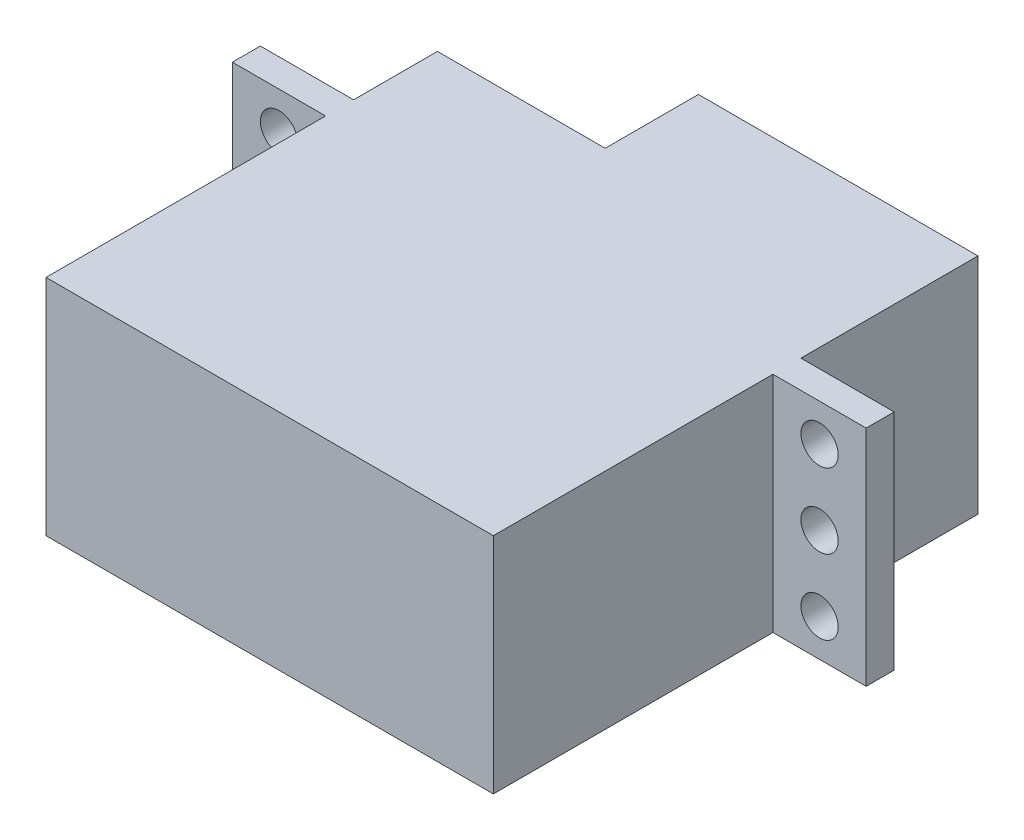
ISO-10303-21;
HEADER;
FILE_DESCRIPTION(('STEP AP214'),'2;1');
FILE_NAME('part.step','',(''),(''),'','','');
FILE_SCHEMA(('AUTOMOTIVE_DESIGN { 1 0 10303 214 1 1 1 1 }'));
ENDSEC;
DATA;
#1=APPLICATION_CONTEXT('core data for automotive mechanical design processes');
#2=APPLICATION_PROTOCOL_DEFINITION('international standard','automotive_design',2000,#1);
#3=PRODUCT_CONTEXT('',#1,'mechanical');
#4=PRODUCT('Part','Part','',(#3));
#5=PRODUCT_RELATED_PRODUCT_CATEGORY('part','',(#4));
#6=PRODUCT_DEFINITION_FORMATION('','',#4);
#7=PRODUCT_DEFINITION_CONTEXT('part definition',#1,'design');
#8=PRODUCT_DEFINITION('design','',#6,#7);
#9=PRODUCT_DEFINITION_SHAPE('','',#8);
#10=(LENGTH_UNIT() NAMED_UNIT(*) SI_UNIT(.MILLI.,.METRE.));
#11=(NAMED_UNIT(*) PLANE_ANGLE_UNIT() SI_UNIT($,.RADIAN.));
#12=(NAMED_UNIT(*) SI_UNIT($,.STERADIAN.) SOLID_ANGLE_UNIT());
#13=UNCERTAINTY_MEASURE_WITH_UNIT(LENGTH_MEASURE(1.E-05),#10,'distance_accuracy_value','');
#14=(GEOMETRIC_REPRESENTATION_CONTEXT(3) GLOBAL_UNCERTAINTY_ASSIGNED_CONTEXT((#13)) GLOBAL_UNIT_ASSIGNED_CONTEXT((#10,
#11,#12)) REPRESENTATION_CONTEXT('',''));
#15=CARTESIAN_POINT('',(0.,0.,0.));
#16=DIRECTION('',(0.,0.,1.));
#17=DIRECTION('',(1.,0.,0.));
#18=AXIS2_PLACEMENT_3D('',#15,#16,#17);
#19=CARTESIAN_POINT('',(0.,0.,-5.));
#20=DIRECTION('',(0.,0.,-1.));
#21=DIRECTION('',(-1.,0.,0.));
#22=AXIS2_PLACEMENT_3D('',#19,#20,#21);
#23=PLANE('',#22);
#24=DIRECTION('',(0.,-1.,0.));
#25=VECTOR('',#24,1.);
#26=CARTESIAN_POINT('',(24.,0.,-5.));
#27=LINE('',#26,#25);
#28=CARTESIAN_POINT('',(24.,0.,-5.));
#29=VERTEX_POINT('',#28);
#30=CARTESIAN_POINT('',(24.,-12.,-5.));
#31=VERTEX_POINT('',#30);
#32=EDGE_CURVE('E144',#29,#31,#27,.T.);
#33=ORIENTED_EDGE('',*,*,#32,.T.);
#34=DIRECTION('',(-1.,0.,0.));
#35=VECTOR('',#34,1.);
#36=CARTESIAN_POINT('',(24.,-12.,-5.));
#37=LINE('',#36,#35);
#38=CARTESIAN_POINT('',(9.,-12.,-5.));
#39=VERTEX_POINT('',#38);
#40=EDGE_CURVE('E151',#31,#39,#37,.T.);
#41=ORIENTED_EDGE('',*,*,#40,.T.);
#42=DIRECTION('',(0.,1.,0.));
#43=VECTOR('',#42,1.);
#44=CARTESIAN_POINT('',(9.,0.,-5.));
#45=LINE('',#44,#43);
#46=CARTESIAN_POINT('',(9.,0.,-5.));
#47=VERTEX_POINT('',#46);
#48=EDGE_CURVE('E157',#39,#47,#45,.T.);
#49=ORIENTED_EDGE('',*,*,#48,.T.);
#50=DIRECTION('',(1.,0.,0.));
#51=VECTOR('',#50,1.);
#52=CARTESIAN_POINT('',(24.,0.,-5.));
#53=LINE('',#52,#51);
#54=EDGE_CURVE('E162',#47,#29,#53,.T.);
#55=ORIENTED_EDGE('',*,*,#54,.T.);
#56=EDGE_LOOP('',(#33,#41,#49,#55));
#57=FACE_BOUND('',#56,.T.);
#58=CARTESIAN_POINT('',(17.,-6.,-5.));
#59=DIRECTION('',(0.,0.,-1.));
#60=DIRECTION('',(-1.,0.,0.));
#61=AXIS2_PLACEMENT_3D('',#58,#59,#60);
#62=CIRCLE('',#61,2.);
#63=CARTESIAN_POINT('',(15.,-6.,-5.));
#64=VERTEX_POINT('',#63);
#65=EDGE_CURVE('E167',#64,#64,#62,.T.);
#66=ORIENTED_EDGE('',*,*,#65,.F.);
#67=EDGE_LOOP('',(#66));
#68=FACE_BOUND('',#67,.T.);
#69=ADVANCED_FACE('F33',(#57,#68),#23,.T.);
#70=CARTESIAN_POINT('',(0.,0.,0.));
#71=DIRECTION('',(0.,0.,1.));
#72=DIRECTION('',(1.,0.,0.));
#73=AXIS2_PLACEMENT_3D('',#70,#71,#72);
#74=PLANE('',#73);
#75=DIRECTION('',(0.,1.,0.));
#76=VECTOR('',#75,1.);
#77=CARTESIAN_POINT('',(9.,0.,0.));
#78=LINE('',#77,#76);
#79=CARTESIAN_POINT('',(9.,-12.,0.));
#80=VERTEX_POINT('',#79);
#81=CARTESIAN_POINT('',(9.,0.,0.));
#82=VERTEX_POINT('',#81);
#83=EDGE_CURVE('E50',#80,#82,#78,.T.);
#84=ORIENTED_EDGE('',*,*,#83,.F.);
#85=DIRECTION('',(1.,0.,0.));
#86=VECTOR('',#85,1.);
#87=CARTESIAN_POINT('',(0.,-12.,0.));
#88=LINE('',#87,#86);
#89=CARTESIAN_POINT('',(0.,-12.,0.));
#90=VERTEX_POINT('',#89);
#91=EDGE_CURVE('E179',#90,#80,#88,.T.);
#92=ORIENTED_EDGE('',*,*,#91,.F.);
#93=DIRECTION('',(0.,-1.,0.));
#94=VECTOR('',#93,1.);
#95=CARTESIAN_POINT('',(0.,0.,0.));
#96=LINE('',#95,#94);
#97=CARTESIAN_POINT('',(0.,0.,0.));
#98=VERTEX_POINT('',#97);
#99=EDGE_CURVE('E264',#98,#90,#96,.T.);
#100=ORIENTED_EDGE('',*,*,#99,.F.);
#101=DIRECTION('',(-1.,0.,0.));
#102=VECTOR('',#101,1.);
#103=CARTESIAN_POINT('',(0.,0.,0.));
#104=LINE('',#103,#102);
#105=EDGE_CURVE('E269',#82,#98,#104,.T.);
#106=ORIENTED_EDGE('',*,*,#105,.F.);
#107=EDGE_LOOP('',(#84,#92,#100,#106));
#108=FACE_BOUND('',#107,.T.);
#109=ADVANCED_FACE('F301',(#108),#74,.F.);
#110=CARTESIAN_POINT('',(0.,0.,21.));
#111=DIRECTION('',(1.,0.,0.));
#112=DIRECTION('',(0.,1.,0.));
#113=AXIS2_PLACEMENT_3D('',#110,#111,#112);
#114=PLANE('',#113);
#115=DIRECTION('',(0.,-1.,0.));
#116=VECTOR('',#115,1.);
#117=CARTESIAN_POINT('',(0.,0.,4.5));
#118=LINE('',#117,#116);
#119=CARTESIAN_POINT('',(0.,0.,4.5));
#120=VERTEX_POINT('',#119);
#121=CARTESIAN_POINT('',(0.,-12.,4.5));
#122=VERTEX_POINT('',#121);
#123=EDGE_CURVE('E262',#120,#122,#118,.T.);
#124=ORIENTED_EDGE('',*,*,#123,.F.);
#125=DIRECTION('',(0.,0.,-1.));
#126=VECTOR('',#125,1.);
#127=CARTESIAN_POINT('',(0.,0.,21.));
#128=LINE('',#127,#126);
#129=EDGE_CURVE('E275',#120,#98,#128,.T.);
#130=ORIENTED_EDGE('',*,*,#129,.T.);
#131=ORIENTED_EDGE('',*,*,#99,.T.);
#132=DIRECTION('',(0.,0.,-1.));
#133=VECTOR('',#132,1.);
#134=CARTESIAN_POINT('',(0.,-12.,21.));
#135=LINE('',#134,#133);
#136=EDGE_CURVE('E42',#122,#90,#135,.T.);
#137=ORIENTED_EDGE('',*,*,#136,.F.);
#138=EDGE_LOOP('',(#124,#130,#131,#137));
#139=FACE_BOUND('',#138,.T.);
#140=ADVANCED_FACE('F299',(#139),#114,.F.);
#141=CARTESIAN_POINT('',(24.,0.,21.));
#142=DIRECTION('',(-1.,0.,0.));
#143=DIRECTION('',(0.,0.,1.));
#144=AXIS2_PLACEMENT_3D('',#141,#142,#143);
#145=PLANE('',#144);
#146=DIRECTION('',(0.,1.,0.));
#147=VECTOR('',#146,1.);
#148=CARTESIAN_POINT('',(24.,0.,4.5));
#149=LINE('',#148,#147);
#150=CARTESIAN_POINT('',(24.,-12.,4.5));
#151=VERTEX_POINT('',#150);
#152=CARTESIAN_POINT('',(24.,0.,4.5));
#153=VERTEX_POINT('',#152);
#154=EDGE_CURVE('E145',#151,#153,#149,.T.);
#155=ORIENTED_EDGE('',*,*,#154,.F.);
#156=DIRECTION('',(0.,0.,-1.));
#157=VECTOR('',#156,1.);
#158=CARTESIAN_POINT('',(24.,-12.,21.));
#159=LINE('',#158,#157);
#160=EDGE_CURVE('E139',#151,#31,#159,.T.);
#161=ORIENTED_EDGE('',*,*,#160,.T.);
#162=ORIENTED_EDGE('',*,*,#32,.F.);
#163=DIRECTION('',(0.,0.,-1.));
#164=VECTOR('',#163,1.);
#165=CARTESIAN_POINT('',(24.,0.,21.));
#166=LINE('',#165,#164);
#167=EDGE_CURVE('E285',#153,#29,#166,.T.);
#168=ORIENTED_EDGE('',*,*,#167,.F.);
#169=EDGE_LOOP('',(#155,#161,#162,#168));
#170=FACE_BOUND('',#169,.T.);
#171=ADVANCED_FACE('F141',(#170),#145,.F.);
#172=CARTESIAN_POINT('',(0.,0.,21.));
#173=VERTEX_POINT('',#172);
#174=CARTESIAN_POINT('',(0.,0.,6.));
#175=VERTEX_POINT('',#174);
#176=EDGE_CURVE('E281',#173,#175,#128,.T.);
#177=ORIENTED_EDGE('',*,*,#176,.T.);
#178=DIRECTION('',(0.,-1.,0.));
#179=VECTOR('',#178,1.);
#180=CARTESIAN_POINT('',(0.,0.,6.));
#181=LINE('',#180,#179);
#182=CARTESIAN_POINT('',(0.,-12.,6.00000000000001));
#183=VERTEX_POINT('',#182);
#184=EDGE_CURVE('E259',#175,#183,#181,.T.);
#185=ORIENTED_EDGE('',*,*,#184,.T.);
#186=CARTESIAN_POINT('',(0.,-12.,21.));
#187=VERTEX_POINT('',#186);
#188=EDGE_CURVE('E11',#187,#183,#135,.T.);
#189=ORIENTED_EDGE('',*,*,#188,.F.);
#190=DIRECTION('',(0.,-1.,0.));
#191=VECTOR('',#190,1.);
#192=CARTESIAN_POINT('',(0.,0.,21.));
#193=LINE('',#192,#191);
#194=EDGE_CURVE('E265',#173,#187,#193,.T.);
#195=ORIENTED_EDGE('',*,*,#194,.F.);
#196=EDGE_LOOP('',(#177,#185,#189,#195));
#197=FACE_BOUND('',#196,.T.);
#198=ADVANCED_FACE('F35',(#197),#114,.F.);
#199=CARTESIAN_POINT('',(0.,-12.,21.));
#200=DIRECTION('',(0.,1.,0.));
#201=DIRECTION('',(0.,0.,1.));
#202=AXIS2_PLACEMENT_3D('',#199,#200,#201);
#203=PLANE('',#202);
#204=ORIENTED_EDGE('',*,*,#188,.T.);
#205=DIRECTION('',(1.,0.,0.));
#206=VECTOR('',#205,1.);
#207=CARTESIAN_POINT('',(-5.,-12.,6.));
#208=LINE('',#207,#206);
#209=CARTESIAN_POINT('',(-5.,-12.,6.));
#210=VERTEX_POINT('',#209);
#211=EDGE_CURVE('E58',#210,#183,#208,.T.);
#212=ORIENTED_EDGE('',*,*,#211,.F.);
#213=DIRECTION('',(0.,0.,1.));
#214=VECTOR('',#213,1.);
#215=CARTESIAN_POINT('',(-5.,-12.,4.5));
#216=LINE('',#215,#214);
#217=CARTESIAN_POINT('',(-5.,-12.,4.5));
#218=VERTEX_POINT('',#217);
#219=EDGE_CURVE('E238',#218,#210,#216,.T.);
#220=ORIENTED_EDGE('',*,*,#219,.F.);
#221=DIRECTION('',(1.,0.,0.));
#222=VECTOR('',#221,1.);
#223=CARTESIAN_POINT('',(-5.,-12.,4.5));
#224=LINE('',#223,#222);
#225=EDGE_CURVE('E228',#218,#122,#224,.T.);
#226=ORIENTED_EDGE('',*,*,#225,.T.);
#227=ORIENTED_EDGE('',*,*,#136,.T.);
#228=ORIENTED_EDGE('',*,*,#91,.T.);
#229=DIRECTION('',(0.,0.,1.));
#230=VECTOR('',#229,1.);
#231=CARTESIAN_POINT('',(9.,-12.,-5.));
#232=LINE('',#231,#230);
#233=EDGE_CURVE('E154',#39,#80,#232,.T.);
#234=ORIENTED_EDGE('',*,*,#233,.F.);
#235=ORIENTED_EDGE('',*,*,#40,.F.);
#236=ORIENTED_EDGE('',*,*,#160,.F.);
#237=CARTESIAN_POINT('',(29.,-12.,4.5));
#238=VERTEX_POINT('',#237);
#239=EDGE_CURVE('E226',#151,#238,#224,.T.);
#240=ORIENTED_EDGE('',*,*,#239,.T.);
#241=DIRECTION('',(0.,0.,1.));
#242=VECTOR('',#241,1.);
#243=CARTESIAN_POINT('',(29.,-12.,4.5));
#244=LINE('',#243,#242);
#245=CARTESIAN_POINT('',(29.,-12.,6.));
#246=VERTEX_POINT('',#245);
#247=EDGE_CURVE('E253',#238,#246,#244,.T.);
#248=ORIENTED_EDGE('',*,*,#247,.T.);
#249=CARTESIAN_POINT('',(24.,-12.,6.));
#250=VERTEX_POINT('',#249);
#251=EDGE_CURVE('E240',#250,#246,#208,.T.);
#252=ORIENTED_EDGE('',*,*,#251,.F.);
#253=CARTESIAN_POINT('',(24.,-12.,21.));
#254=VERTEX_POINT('',#253);
#255=EDGE_CURVE('E147',#254,#250,#159,.T.);
#256=ORIENTED_EDGE('',*,*,#255,.F.);
#257=DIRECTION('',(1.,0.,0.));
#258=VECTOR('',#257,1.);
#259=CARTESIAN_POINT('',(0.,-12.,21.));
#260=LINE('',#259,#258);
#261=EDGE_CURVE('E268',#187,#254,#260,.T.);
#262=ORIENTED_EDGE('',*,*,#261,.F.);
#263=EDGE_LOOP('',(#204,#212,#220,#226,#227,#228,#234,#235,#236,#240,#248,#252,#256,#262));
#264=FACE_BOUND('',#263,.T.);
#265=ADVANCED_FACE('F152',(#264),#203,.F.);
#266=ORIENTED_EDGE('',*,*,#255,.T.);
#267=DIRECTION('',(0.,1.,0.));
#268=VECTOR('',#267,1.);
#269=CARTESIAN_POINT('',(24.,0.,6.));
#270=LINE('',#269,#268);
#271=CARTESIAN_POINT('',(24.,0.,6.00000000000001));
#272=VERTEX_POINT('',#271);
#273=EDGE_CURVE('E250',#250,#272,#270,.T.);
#274=ORIENTED_EDGE('',*,*,#273,.T.);
#275=CARTESIAN_POINT('',(24.,0.,21.));
#276=VERTEX_POINT('',#275);
#277=EDGE_CURVE('E148',#276,#272,#166,.T.);
#278=ORIENTED_EDGE('',*,*,#277,.F.);
#279=DIRECTION('',(0.,1.,0.));
#280=VECTOR('',#279,1.);
#281=CARTESIAN_POINT('',(24.,0.,21.));
#282=LINE('',#281,#280);
#283=EDGE_CURVE('E271',#254,#276,#282,.T.);
#284=ORIENTED_EDGE('',*,*,#283,.F.);
#285=EDGE_LOOP('',(#266,#274,#278,#284));
#286=FACE_BOUND('',#285,.T.);
#287=ADVANCED_FACE('F320',(#286),#145,.F.);
#288=CARTESIAN_POINT('',(0.,0.,21.));
#289=DIRECTION('',(0.,-1.,0.));
#290=DIRECTION('',(0.,0.,-1.));
#291=AXIS2_PLACEMENT_3D('',#288,#289,#290);
#292=PLANE('',#291);
#293=ORIENTED_EDGE('',*,*,#277,.T.);
#294=DIRECTION('',(-1.,0.,0.));
#295=VECTOR('',#294,1.);
#296=CARTESIAN_POINT('',(-5.,0.,6.));
#297=LINE('',#296,#295);
#298=CARTESIAN_POINT('',(29.,0.,6.));
#299=VERTEX_POINT('',#298);
#300=EDGE_CURVE('E227',#299,#272,#297,.T.);
#301=ORIENTED_EDGE('',*,*,#300,.F.);
#302=DIRECTION('',(0.,0.,1.));
#303=VECTOR('',#302,1.);
#304=CARTESIAN_POINT('',(29.,0.,4.5));
#305=LINE('',#304,#303);
#306=CARTESIAN_POINT('',(29.,0.,4.5));
#307=VERTEX_POINT('',#306);
#308=EDGE_CURVE('E251',#307,#299,#305,.T.);
#309=ORIENTED_EDGE('',*,*,#308,.F.);
#310=DIRECTION('',(-1.,0.,0.));
#311=VECTOR('',#310,1.);
#312=CARTESIAN_POINT('',(-5.,0.,4.5));
#313=LINE('',#312,#311);
#314=EDGE_CURVE('E235',#307,#153,#313,.T.);
#315=ORIENTED_EDGE('',*,*,#314,.T.);
#316=ORIENTED_EDGE('',*,*,#167,.T.);
#317=ORIENTED_EDGE('',*,*,#54,.F.);
#318=DIRECTION('',(0.,0.,1.));
#319=VECTOR('',#318,1.);
#320=CARTESIAN_POINT('',(9.,0.,-5.));
#321=LINE('',#320,#319);
#322=EDGE_CURVE('E172',#47,#82,#321,.T.);
#323=ORIENTED_EDGE('',*,*,#322,.T.);
#324=ORIENTED_EDGE('',*,*,#105,.T.);
#325=ORIENTED_EDGE('',*,*,#129,.F.);
#326=CARTESIAN_POINT('',(-5.,0.,4.5));
#327=VERTEX_POINT('',#326);
#328=EDGE_CURVE('E234',#120,#327,#313,.T.);
#329=ORIENTED_EDGE('',*,*,#328,.T.);
#330=DIRECTION('',(0.,0.,1.));
#331=VECTOR('',#330,1.);
#332=CARTESIAN_POINT('',(-5.,0.,4.5));
#333=LINE('',#332,#331);
#334=CARTESIAN_POINT('',(-5.,0.,6.));
#335=VERTEX_POINT('',#334);
#336=EDGE_CURVE('E247',#327,#335,#333,.T.);
#337=ORIENTED_EDGE('',*,*,#336,.T.);
#338=EDGE_CURVE('E245',#175,#335,#297,.T.);
#339=ORIENTED_EDGE('',*,*,#338,.F.);
#340=ORIENTED_EDGE('',*,*,#176,.F.);
#341=DIRECTION('',(-1.,0.,0.));
#342=VECTOR('',#341,1.);
#343=CARTESIAN_POINT('',(0.,0.,21.));
#344=LINE('',#343,#342);
#345=EDGE_CURVE('E273',#276,#173,#344,.T.);
#346=ORIENTED_EDGE('',*,*,#345,.F.);
#347=EDGE_LOOP('',(#293,#301,#309,#315,#316,#317,#323,#324,#325,#329,#337,#339,#340,#346));
#348=FACE_BOUND('',#347,.T.);
#349=ADVANCED_FACE('F311',(#348),#292,.F.);
#350=CARTESIAN_POINT('',(0.,0.,21.));
#351=DIRECTION('',(0.,0.,1.));
#352=DIRECTION('',(1.,0.,0.));
#353=AXIS2_PLACEMENT_3D('',#350,#351,#352);
#354=PLANE('',#353);
#355=ORIENTED_EDGE('',*,*,#194,.T.);
#356=ORIENTED_EDGE('',*,*,#261,.T.);
#357=ORIENTED_EDGE('',*,*,#283,.T.);
#358=ORIENTED_EDGE('',*,*,#345,.T.);
#359=EDGE_LOOP('',(#355,#356,#357,#358));
#360=FACE_BOUND('',#359,.T.);
#361=ADVANCED_FACE('F318',(#360),#354,.T.);
#362=CARTESIAN_POINT('',(29.,0.,4.5));
#363=DIRECTION('',(1.,0.,0.));
#364=DIRECTION('',(0.,1.,0.));
#365=AXIS2_PLACEMENT_3D('',#362,#363,#364);
#366=PLANE('',#365);
#367=DIRECTION('',(0.,1.,0.));
#368=VECTOR('',#367,1.);
#369=CARTESIAN_POINT('',(29.,0.,6.));
#370=LINE('',#369,#368);
#371=EDGE_CURVE('E242',#246,#299,#370,.T.);
#372=ORIENTED_EDGE('',*,*,#371,.F.);
#373=ORIENTED_EDGE('',*,*,#247,.F.);
#374=DIRECTION('',(0.,1.,0.));
#375=VECTOR('',#374,1.);
#376=CARTESIAN_POINT('',(29.,0.,4.5));
#377=LINE('',#376,#375);
#378=EDGE_CURVE('E231',#238,#307,#377,.T.);
#379=ORIENTED_EDGE('',*,*,#378,.T.);
#380=ORIENTED_EDGE('',*,*,#308,.T.);
#381=EDGE_LOOP('',(#372,#373,#379,#380));
#382=FACE_BOUND('',#381,.T.);
#383=ADVANCED_FACE('F327',(#382),#366,.T.);
#384=CARTESIAN_POINT('',(26.5000000000001,-10.,4.5));
#385=DIRECTION('',(0.,0.,1.));
#386=DIRECTION('',(1.,0.,0.));
#387=AXIS2_PLACEMENT_3D('',#384,#385,#386);
#388=CYLINDRICAL_SURFACE('',#387,0.999999999999998);
#389=CARTESIAN_POINT('',(26.5000000000001,-10.,4.5));
#390=DIRECTION('',(0.,0.,1.));
#391=DIRECTION('',(1.,0.,0.));
#392=AXIS2_PLACEMENT_3D('',#389,#390,#391);
#393=CIRCLE('',#392,0.999999999999998);
#394=CARTESIAN_POINT('',(27.5000000000001,-10.,4.5));
#395=VERTEX_POINT('',#394);
#396=EDGE_CURVE('E199',#395,#395,#393,.T.);
#397=ORIENTED_EDGE('',*,*,#396,.F.);
#398=EDGE_LOOP('',(#397));
#399=FACE_BOUND('',#398,.T.);
#400=CARTESIAN_POINT('',(26.5000000000001,-10.,6.));
#401=DIRECTION('',(0.,0.,1.));
#402=DIRECTION('',(1.,0.,0.));
#403=AXIS2_PLACEMENT_3D('',#400,#401,#402);
#404=CIRCLE('',#403,0.999999999999998);
#405=CARTESIAN_POINT('',(27.5000000000001,-10.,6.));
#406=VERTEX_POINT('',#405);
#407=EDGE_CURVE('E196',#406,#406,#404,.T.);
#408=ORIENTED_EDGE('',*,*,#407,.T.);
#409=EDGE_LOOP('',(#408));
#410=FACE_BOUND('',#409,.T.);
#411=ADVANCED_FACE('F366',(#399,#410),#388,.F.);
#412=CARTESIAN_POINT('',(26.5,-6.,4.5));
#413=DIRECTION('',(0.,0.,1.));
#414=DIRECTION('',(1.,0.,0.));
#415=AXIS2_PLACEMENT_3D('',#412,#413,#414);
#416=CYLINDRICAL_SURFACE('',#415,0.999999999999998);
#417=CARTESIAN_POINT('',(26.5,-6.,4.5));
#418=DIRECTION('',(0.,0.,1.));
#419=DIRECTION('',(1.,0.,0.));
#420=AXIS2_PLACEMENT_3D('',#417,#418,#419);
#421=CIRCLE('',#420,0.999999999999998);
#422=CARTESIAN_POINT('',(27.5,-6.,4.5));
#423=VERTEX_POINT('',#422);
#424=EDGE_CURVE('E205',#423,#423,#421,.T.);
#425=ORIENTED_EDGE('',*,*,#424,.F.);
#426=EDGE_LOOP('',(#425));
#427=FACE_BOUND('',#426,.T.);
#428=CARTESIAN_POINT('',(26.5,-6.,6.));
#429=DIRECTION('',(0.,0.,1.));
#430=DIRECTION('',(1.,0.,0.));
#431=AXIS2_PLACEMENT_3D('',#428,#429,#430);
#432=CIRCLE('',#431,0.999999999999998);
#433=CARTESIAN_POINT('',(27.5,-6.,6.));
#434=VERTEX_POINT('',#433);
#435=EDGE_CURVE('E202',#434,#434,#432,.T.);
#436=ORIENTED_EDGE('',*,*,#435,.T.);
#437=EDGE_LOOP('',(#436));
#438=FACE_BOUND('',#437,.T.);
#439=ADVANCED_FACE('F369',(#427,#438),#416,.F.);
#440=CARTESIAN_POINT('',(26.5,-2.,4.5));
#441=DIRECTION('',(0.,0.,1.));
#442=DIRECTION('',(1.,0.,0.));
#443=AXIS2_PLACEMENT_3D('',#440,#441,#442);
#444=CYLINDRICAL_SURFACE('',#443,0.999999999999998);
#445=CARTESIAN_POINT('',(26.5,-2.,4.5));
#446=DIRECTION('',(0.,0.,1.));
#447=DIRECTION('',(1.,0.,0.));
#448=AXIS2_PLACEMENT_3D('',#445,#446,#447);
#449=CIRCLE('',#448,0.999999999999998);
#450=CARTESIAN_POINT('',(27.5,-2.,4.5));
#451=VERTEX_POINT('',#450);
#452=EDGE_CURVE('E211',#451,#451,#449,.T.);
#453=ORIENTED_EDGE('',*,*,#452,.F.);
#454=EDGE_LOOP('',(#453));
#455=FACE_BOUND('',#454,.T.);
#456=CARTESIAN_POINT('',(26.5,-2.,6.));
#457=DIRECTION('',(0.,0.,1.));
#458=DIRECTION('',(1.,0.,0.));
#459=AXIS2_PLACEMENT_3D('',#456,#457,#458);
#460=CIRCLE('',#459,0.999999999999998);
#461=CARTESIAN_POINT('',(27.5,-2.,6.));
#462=VERTEX_POINT('',#461);
#463=EDGE_CURVE('E208',#462,#462,#460,.T.);
#464=ORIENTED_EDGE('',*,*,#463,.T.);
#465=EDGE_LOOP('',(#464));
#466=FACE_BOUND('',#465,.T.);
#467=ADVANCED_FACE('F339',(#455,#466),#444,.F.);
#468=CARTESIAN_POINT('',(0.,0.,6.));
#469=DIRECTION('',(0.,0.,1.));
#470=DIRECTION('',(1.,0.,0.));
#471=AXIS2_PLACEMENT_3D('',#468,#469,#470);
#472=PLANE('',#471);
#473=ORIENTED_EDGE('',*,*,#463,.F.);
#474=EDGE_LOOP('',(#473));
#475=FACE_BOUND('',#474,.T.);
#476=ORIENTED_EDGE('',*,*,#435,.F.);
#477=EDGE_LOOP('',(#476));
#478=FACE_BOUND('',#477,.T.);
#479=ORIENTED_EDGE('',*,*,#407,.F.);
#480=EDGE_LOOP('',(#479));
#481=FACE_BOUND('',#480,.T.);
#482=ORIENTED_EDGE('',*,*,#273,.F.);
#483=ORIENTED_EDGE('',*,*,#251,.T.);
#484=ORIENTED_EDGE('',*,*,#371,.T.);
#485=ORIENTED_EDGE('',*,*,#300,.T.);
#486=EDGE_LOOP('',(#482,#483,#484,#485));
#487=FACE_BOUND('',#486,.T.);
#488=ADVANCED_FACE('F322',(#475,#478,#481,#487),#472,.T.);
#489=CARTESIAN_POINT('',(0.,0.,4.5));
#490=DIRECTION('',(0.,0.,1.));
#491=DIRECTION('',(1.,0.,0.));
#492=AXIS2_PLACEMENT_3D('',#489,#490,#491);
#493=PLANE('',#492);
#494=ORIENTED_EDGE('',*,*,#452,.T.);
#495=EDGE_LOOP('',(#494));
#496=FACE_BOUND('',#495,.T.);
#497=ORIENTED_EDGE('',*,*,#424,.T.);
#498=EDGE_LOOP('',(#497));
#499=FACE_BOUND('',#498,.T.);
#500=ORIENTED_EDGE('',*,*,#396,.T.);
#501=EDGE_LOOP('',(#500));
#502=FACE_BOUND('',#501,.T.);
#503=ORIENTED_EDGE('',*,*,#239,.F.);
#504=ORIENTED_EDGE('',*,*,#154,.T.);
#505=ORIENTED_EDGE('',*,*,#314,.F.);
#506=ORIENTED_EDGE('',*,*,#378,.F.);
#507=EDGE_LOOP('',(#503,#504,#505,#506));
#508=FACE_BOUND('',#507,.T.);
#509=ADVANCED_FACE('F330',(#496,#499,#502,#508),#493,.F.);
#510=CARTESIAN_POINT('',(-2.5,-2.,4.5));
#511=DIRECTION('',(0.,0.,1.));
#512=DIRECTION('',(1.,0.,0.));
#513=AXIS2_PLACEMENT_3D('',#510,#511,#512);
#514=CIRCLE('',#513,1.);
#515=CARTESIAN_POINT('',(-1.5,-2.,4.5));
#516=VERTEX_POINT('',#515);
#517=EDGE_CURVE('E217',#516,#516,#514,.T.);
#518=ORIENTED_EDGE('',*,*,#517,.T.);
#519=EDGE_LOOP('',(#518));
#520=FACE_BOUND('',#519,.T.);
#521=CARTESIAN_POINT('',(-2.49999999999996,-6.,4.5));
#522=DIRECTION('',(0.,0.,1.));
#523=DIRECTION('',(1.,0.,0.));
#524=AXIS2_PLACEMENT_3D('',#521,#522,#523);
#525=CIRCLE('',#524,1.);
#526=CARTESIAN_POINT('',(-1.49999999999996,-6.,4.5));
#527=VERTEX_POINT('',#526);
#528=EDGE_CURVE('E193',#527,#527,#525,.T.);
#529=ORIENTED_EDGE('',*,*,#528,.T.);
#530=EDGE_LOOP('',(#529));
#531=FACE_BOUND('',#530,.T.);
#532=CARTESIAN_POINT('',(-2.49999999999992,-10.,4.5));
#533=DIRECTION('',(0.,0.,1.));
#534=DIRECTION('',(1.,0.,0.));
#535=AXIS2_PLACEMENT_3D('',#532,#533,#534);
#536=CIRCLE('',#535,1.);
#537=CARTESIAN_POINT('',(-1.49999999999992,-10.,4.5));
#538=VERTEX_POINT('',#537);
#539=EDGE_CURVE('E175',#538,#538,#536,.T.);
#540=ORIENTED_EDGE('',*,*,#539,.T.);
#541=EDGE_LOOP('',(#540));
#542=FACE_BOUND('',#541,.T.);
#543=ORIENTED_EDGE('',*,*,#328,.F.);
#544=ORIENTED_EDGE('',*,*,#123,.T.);
#545=ORIENTED_EDGE('',*,*,#225,.F.);
#546=DIRECTION('',(0.,-1.,0.));
#547=VECTOR('',#546,1.);
#548=CARTESIAN_POINT('',(-5.,0.,4.5));
#549=LINE('',#548,#547);
#550=EDGE_CURVE('E223',#327,#218,#549,.T.);
#551=ORIENTED_EDGE('',*,*,#550,.F.);
#552=EDGE_LOOP('',(#543,#544,#545,#551));
#553=FACE_BOUND('',#552,.T.);
#554=ADVANCED_FACE('F305',(#520,#531,#542,#553),#493,.F.);
#555=CARTESIAN_POINT('',(-2.5,-2.,6.));
#556=DIRECTION('',(0.,0.,1.));
#557=DIRECTION('',(1.,0.,0.));
#558=AXIS2_PLACEMENT_3D('',#555,#556,#557);
#559=CIRCLE('',#558,1.);
#560=CARTESIAN_POINT('',(-1.5,-2.,6.));
#561=VERTEX_POINT('',#560);
#562=EDGE_CURVE('E214',#561,#561,#559,.T.);
#563=ORIENTED_EDGE('',*,*,#562,.F.);
#564=EDGE_LOOP('',(#563));
#565=FACE_BOUND('',#564,.T.);
#566=CARTESIAN_POINT('',(-2.49999999999996,-6.,6.));
#567=DIRECTION('',(0.,0.,1.));
#568=DIRECTION('',(1.,0.,0.));
#569=AXIS2_PLACEMENT_3D('',#566,#567,#568);
#570=CIRCLE('',#569,1.);
#571=CARTESIAN_POINT('',(-1.49999999999996,-6.,6.));
#572=VERTEX_POINT('',#571);
#573=EDGE_CURVE('E191',#572,#572,#570,.T.);
#574=ORIENTED_EDGE('',*,*,#573,.F.);
#575=EDGE_LOOP('',(#574));
#576=FACE_BOUND('',#575,.T.);
#577=CARTESIAN_POINT('',(-2.49999999999992,-10.,6.));
#578=DIRECTION('',(0.,0.,1.));
#579=DIRECTION('',(1.,0.,0.));
#580=AXIS2_PLACEMENT_3D('',#577,#578,#579);
#581=CIRCLE('',#580,1.);
#582=CARTESIAN_POINT('',(-1.49999999999992,-10.,6.));
#583=VERTEX_POINT('',#582);
#584=EDGE_CURVE('E185',#583,#583,#581,.T.);
#585=ORIENTED_EDGE('',*,*,#584,.F.);
#586=EDGE_LOOP('',(#585));
#587=FACE_BOUND('',#586,.T.);
#588=ORIENTED_EDGE('',*,*,#184,.F.);
#589=ORIENTED_EDGE('',*,*,#338,.T.);
#590=DIRECTION('',(0.,-1.,0.));
#591=VECTOR('',#590,1.);
#592=CARTESIAN_POINT('',(-5.,0.,6.));
#593=LINE('',#592,#591);
#594=EDGE_CURVE('E220',#335,#210,#593,.T.);
#595=ORIENTED_EDGE('',*,*,#594,.T.);
#596=ORIENTED_EDGE('',*,*,#211,.T.);
#597=EDGE_LOOP('',(#588,#589,#595,#596));
#598=FACE_BOUND('',#597,.T.);
#599=ADVANCED_FACE('F312',(#565,#576,#587,#598),#472,.T.);
#600=CARTESIAN_POINT('',(-5.,0.,4.5));
#601=DIRECTION('',(-1.,0.,0.));
#602=DIRECTION('',(0.,-1.,0.));
#603=AXIS2_PLACEMENT_3D('',#600,#601,#602);
#604=PLANE('',#603);
#605=ORIENTED_EDGE('',*,*,#594,.F.);
#606=ORIENTED_EDGE('',*,*,#336,.F.);
#607=ORIENTED_EDGE('',*,*,#550,.T.);
#608=ORIENTED_EDGE('',*,*,#219,.T.);
#609=EDGE_LOOP('',(#605,#606,#607,#608));
#610=FACE_BOUND('',#609,.T.);
#611=ADVANCED_FACE('F309',(#610),#604,.T.);
#612=CARTESIAN_POINT('',(-2.5,-2.,4.5));
#613=DIRECTION('',(0.,0.,1.));
#614=DIRECTION('',(1.,0.,0.));
#615=AXIS2_PLACEMENT_3D('',#612,#613,#614);
#616=CYLINDRICAL_SURFACE('',#615,1.);
#617=ORIENTED_EDGE('',*,*,#517,.F.);
#618=EDGE_LOOP('',(#617));
#619=FACE_BOUND('',#618,.T.);
#620=ORIENTED_EDGE('',*,*,#562,.T.);
#621=EDGE_LOOP('',(#620));
#622=FACE_BOUND('',#621,.T.);
#623=ADVANCED_FACE('F364',(#619,#622),#616,.F.);
#624=CARTESIAN_POINT('',(-2.49999999999996,-6.,4.5));
#625=DIRECTION('',(0.,0.,1.));
#626=DIRECTION('',(1.,0.,0.));
#627=AXIS2_PLACEMENT_3D('',#624,#625,#626);
#628=CYLINDRICAL_SURFACE('',#627,1.);
#629=ORIENTED_EDGE('',*,*,#528,.F.);
#630=EDGE_LOOP('',(#629));
#631=FACE_BOUND('',#630,.T.);
#632=ORIENTED_EDGE('',*,*,#573,.T.);
#633=EDGE_LOOP('',(#632));
#634=FACE_BOUND('',#633,.T.);
#635=ADVANCED_FACE('F360',(#631,#634),#628,.F.);
#636=CARTESIAN_POINT('',(-2.49999999999992,-10.,4.5));
#637=DIRECTION('',(0.,0.,1.));
#638=DIRECTION('',(1.,0.,0.));
#639=AXIS2_PLACEMENT_3D('',#636,#637,#638);
#640=CYLINDRICAL_SURFACE('',#639,1.);
#641=ORIENTED_EDGE('',*,*,#539,.F.);
#642=EDGE_LOOP('',(#641));
#643=FACE_BOUND('',#642,.T.);
#644=ORIENTED_EDGE('',*,*,#584,.T.);
#645=EDGE_LOOP('',(#644));
#646=FACE_BOUND('',#645,.T.);
#647=ADVANCED_FACE('F357',(#643,#646),#640,.F.);
#648=CARTESIAN_POINT('',(9.,0.,-5.));
#649=DIRECTION('',(1.,0.,0.));
#650=DIRECTION('',(0.,1.,0.));
#651=AXIS2_PLACEMENT_3D('',#648,#649,#650);
#652=PLANE('',#651);
#653=ORIENTED_EDGE('',*,*,#83,.T.);
#654=ORIENTED_EDGE('',*,*,#322,.F.);
#655=ORIENTED_EDGE('',*,*,#48,.F.);
#656=ORIENTED_EDGE('',*,*,#233,.T.);
#657=EDGE_LOOP('',(#653,#654,#655,#656));
#658=FACE_BOUND('',#657,.T.);
#659=ADVANCED_FACE('F354',(#658),#652,.F.);
#660=CARTESIAN_POINT('',(17.,-6.,-9.));
#661=DIRECTION('',(0.,0.,1.));
#662=DIRECTION('',(1.,0.,0.));
#663=AXIS2_PLACEMENT_3D('',#660,#661,#662);
#664=CYLINDRICAL_SURFACE('',#663,2.);
#665=CARTESIAN_POINT('',(17.,-6.,-9.));
#666=DIRECTION('',(0.,0.,-1.));
#667=DIRECTION('',(-1.,0.,0.));
#668=AXIS2_PLACEMENT_3D('',#665,#666,#667);
#669=CIRCLE('',#668,2.);
#670=CARTESIAN_POINT('',(15.,-6.,-9.));
#671=VERTEX_POINT('',#670);
#672=EDGE_CURVE('E164',#671,#671,#669,.T.);
#673=ORIENTED_EDGE('',*,*,#672,.F.);
#674=EDGE_LOOP('',(#673));
#675=FACE_BOUND('',#674,.T.);
#676=ORIENTED_EDGE('',*,*,#65,.T.);
#677=EDGE_LOOP('',(#676));
#678=FACE_BOUND('',#677,.T.);
#679=ADVANCED_FACE('F352',(#675,#678),#664,.T.);
#680=CARTESIAN_POINT('',(17.,-6.,-9.));
#681=DIRECTION('',(0.,0.,-1.));
#682=DIRECTION('',(-1.,0.,0.));
#683=AXIS2_PLACEMENT_3D('',#680,#681,#682);
#684=PLANE('',#683);
#685=ORIENTED_EDGE('',*,*,#672,.T.);
#686=EDGE_LOOP('',(#685));
#687=FACE_BOUND('',#686,.T.);
#688=ADVANCED_FACE('F453',(#687),#684,.T.);
#689=CLOSED_SHELL('',(#69,#109,#140,#171,#198,#265,#287,#349,#361,#383,#411,#439,#467,#488,#509,
#554,#599,#611,#623,#635,#647,#659,#679,#688));
#690=MANIFOLD_SOLID_BREP('B2',#689);
#691=ADVANCED_BREP_SHAPE_REPRESENTATION('',(#18,#690),#14);
#692=SHAPE_DEFINITION_REPRESENTATION(#9,#691);
ENDSEC;
END-ISO-10303-21;
